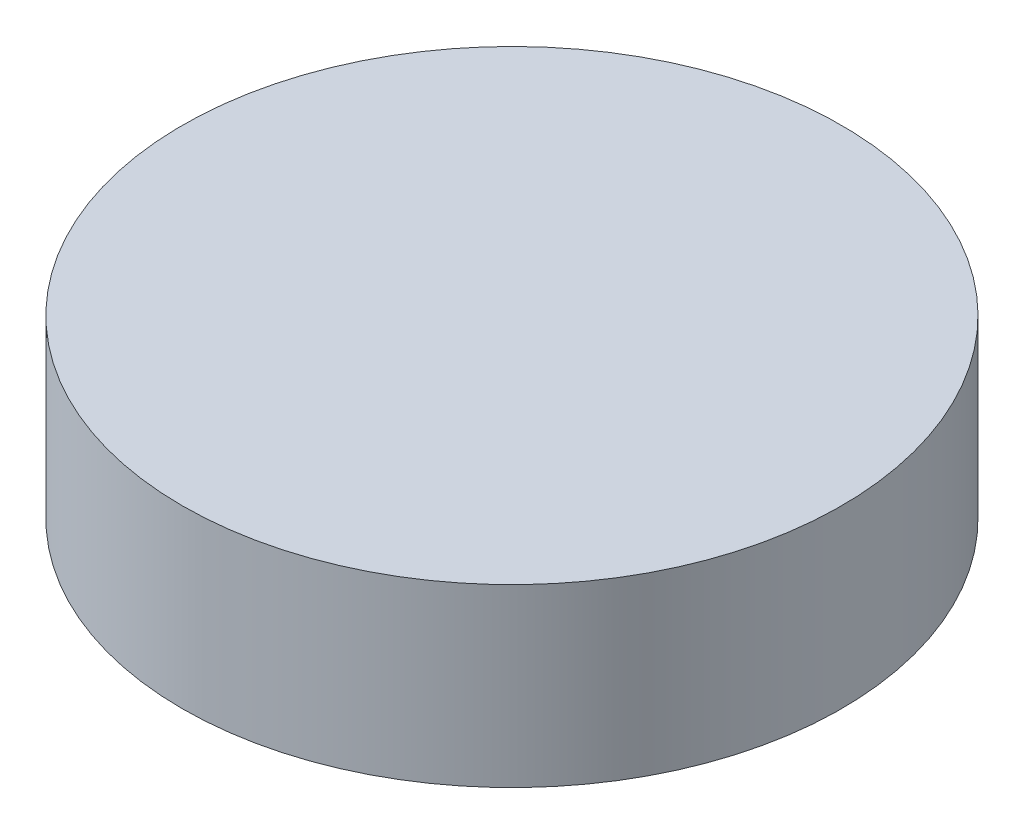
ISO-10303-21;
HEADER;
FILE_DESCRIPTION(('STEP AP214'),'2;1');
FILE_NAME('part.step','',(''),(''),'','','');
FILE_SCHEMA(('AUTOMOTIVE_DESIGN { 1 0 10303 214 1 1 1 1 }'));
ENDSEC;
DATA;
#1=APPLICATION_CONTEXT('core data for automotive mechanical design processes');
#2=APPLICATION_PROTOCOL_DEFINITION('international standard','automotive_design',2000,#1);
#3=PRODUCT_CONTEXT('',#1,'mechanical');
#4=PRODUCT('Part','Part','',(#3));
#5=PRODUCT_RELATED_PRODUCT_CATEGORY('part','',(#4));
#6=PRODUCT_DEFINITION_FORMATION('','',#4);
#7=PRODUCT_DEFINITION_CONTEXT('part definition',#1,'design');
#8=PRODUCT_DEFINITION('design','',#6,#7);
#9=PRODUCT_DEFINITION_SHAPE('','',#8);
#10=(LENGTH_UNIT() NAMED_UNIT(*) SI_UNIT(.MILLI.,.METRE.));
#11=(NAMED_UNIT(*) PLANE_ANGLE_UNIT() SI_UNIT($,.RADIAN.));
#12=(NAMED_UNIT(*) SI_UNIT($,.STERADIAN.) SOLID_ANGLE_UNIT());
#13=UNCERTAINTY_MEASURE_WITH_UNIT(LENGTH_MEASURE(1.E-05),#10,'distance_accuracy_value','');
#14=(GEOMETRIC_REPRESENTATION_CONTEXT(3) GLOBAL_UNCERTAINTY_ASSIGNED_CONTEXT((#13)) GLOBAL_UNIT_ASSIGNED_CONTEXT((#10,
#11,#12)) REPRESENTATION_CONTEXT('',''));
#15=CARTESIAN_POINT('',(0.,0.,0.));
#16=DIRECTION('',(0.,0.,1.));
#17=DIRECTION('',(1.,0.,0.));
#18=AXIS2_PLACEMENT_3D('',#15,#16,#17);
#19=CARTESIAN_POINT('',(0.,5.08,0.));
#20=DIRECTION('',(0.,-1.,0.));
#21=DIRECTION('',(0.,0.,-1.));
#22=AXIS2_PLACEMENT_3D('',#19,#20,#21);
#23=CYLINDRICAL_SURFACE('',#22,9.525);
#24=CARTESIAN_POINT('',(0.,5.08,0.));
#25=DIRECTION('',(0.,1.,0.));
#26=DIRECTION('',(0.,0.,1.));
#27=AXIS2_PLACEMENT_3D('',#24,#25,#26);
#28=CIRCLE('',#27,9.525);
#29=CARTESIAN_POINT('',(0.,5.08,9.525));
#30=VERTEX_POINT('',#29);
#31=EDGE_CURVE('E10',#30,#30,#28,.T.);
#32=ORIENTED_EDGE('',*,*,#31,.F.);
#33=EDGE_LOOP('',(#32));
#34=FACE_BOUND('',#33,.T.);
#35=CARTESIAN_POINT('',(0.,0.,0.));
#36=DIRECTION('',(0.,1.,0.));
#37=DIRECTION('',(0.,0.,1.));
#38=AXIS2_PLACEMENT_3D('',#35,#36,#37);
#39=CIRCLE('',#38,9.525);
#40=CARTESIAN_POINT('',(0.,0.,9.525));
#41=VERTEX_POINT('',#40);
#42=EDGE_CURVE('E40',#41,#41,#39,.T.);
#43=ORIENTED_EDGE('',*,*,#42,.T.);
#44=EDGE_LOOP('',(#43));
#45=FACE_BOUND('',#44,.T.);
#46=ADVANCED_FACE('F37',(#34,#45),#23,.T.);
#47=CARTESIAN_POINT('',(0.,5.08,0.));
#48=DIRECTION('',(0.,1.,0.));
#49=DIRECTION('',(0.,0.,1.));
#50=AXIS2_PLACEMENT_3D('',#47,#48,#49);
#51=PLANE('',#50);
#52=ORIENTED_EDGE('',*,*,#31,.T.);
#53=EDGE_LOOP('',(#52));
#54=FACE_BOUND('',#53,.T.);
#55=ADVANCED_FACE('F70',(#54),#51,.T.);
#56=CARTESIAN_POINT('',(0.,0.,0.));
#57=DIRECTION('',(0.,1.,0.));
#58=DIRECTION('',(0.,0.,1.));
#59=AXIS2_PLACEMENT_3D('',#56,#57,#58);
#60=PLANE('',#59);
#61=CARTESIAN_POINT('',(0.,0.,0.));
#62=DIRECTION('',(0.,-1.,0.));
#63=DIRECTION('',(0.,0.,-1.));
#64=AXIS2_PLACEMENT_3D('',#61,#62,#63);
#65=CIRCLE('',#64,2.8702);
#66=CARTESIAN_POINT('',(0.,0.,-2.8702));
#67=VERTEX_POINT('',#66);
#68=EDGE_CURVE('E51',#67,#67,#65,.T.);
#69=ORIENTED_EDGE('',*,*,#68,.F.);
#70=EDGE_LOOP('',(#69));
#71=FACE_BOUND('',#70,.T.);
#72=ORIENTED_EDGE('',*,*,#42,.F.);
#73=EDGE_LOOP('',(#72));
#74=FACE_BOUND('',#73,.T.);
#75=ADVANCED_FACE('F64',(#71,#74),#60,.F.);
#76=CARTESIAN_POINT('',(0.,2.54,0.));
#77=DIRECTION('',(0.,-1.,0.));
#78=DIRECTION('',(0.,0.,-1.));
#79=AXIS2_PLACEMENT_3D('',#76,#77,#78);
#80=CYLINDRICAL_SURFACE('',#79,2.8702);
#81=CARTESIAN_POINT('',(0.,2.54,0.));
#82=DIRECTION('',(0.,-1.,0.));
#83=DIRECTION('',(0.,0.,-1.));
#84=AXIS2_PLACEMENT_3D('',#81,#82,#83);
#85=CIRCLE('',#84,2.8702);
#86=CARTESIAN_POINT('',(0.,2.54,-2.8702));
#87=VERTEX_POINT('',#86);
#88=EDGE_CURVE('E49',#87,#87,#85,.T.);
#89=ORIENTED_EDGE('',*,*,#88,.F.);
#90=EDGE_LOOP('',(#89));
#91=FACE_BOUND('',#90,.T.);
#92=ORIENTED_EDGE('',*,*,#68,.T.);
#93=EDGE_LOOP('',(#92));
#94=FACE_BOUND('',#93,.T.);
#95=ADVANCED_FACE('F61',(#91,#94),#80,.F.);
#96=CARTESIAN_POINT('',(0.,2.54,0.));
#97=DIRECTION('',(0.,-1.,0.));
#98=DIRECTION('',(0.,0.,-1.));
#99=AXIS2_PLACEMENT_3D('',#96,#97,#98);
#100=PLANE('',#99);
#101=ORIENTED_EDGE('',*,*,#88,.T.);
#102=EDGE_LOOP('',(#101));
#103=FACE_BOUND('',#102,.T.);
#104=ADVANCED_FACE('F59',(#103),#100,.T.);
#105=CLOSED_SHELL('',(#46,#55,#75,#95,#104));
#106=MANIFOLD_SOLID_BREP('B2',#105);
#107=ADVANCED_BREP_SHAPE_REPRESENTATION('',(#18,#106),#14);
#108=SHAPE_DEFINITION_REPRESENTATION(#9,#107);
ENDSEC;
END-ISO-10303-21;
